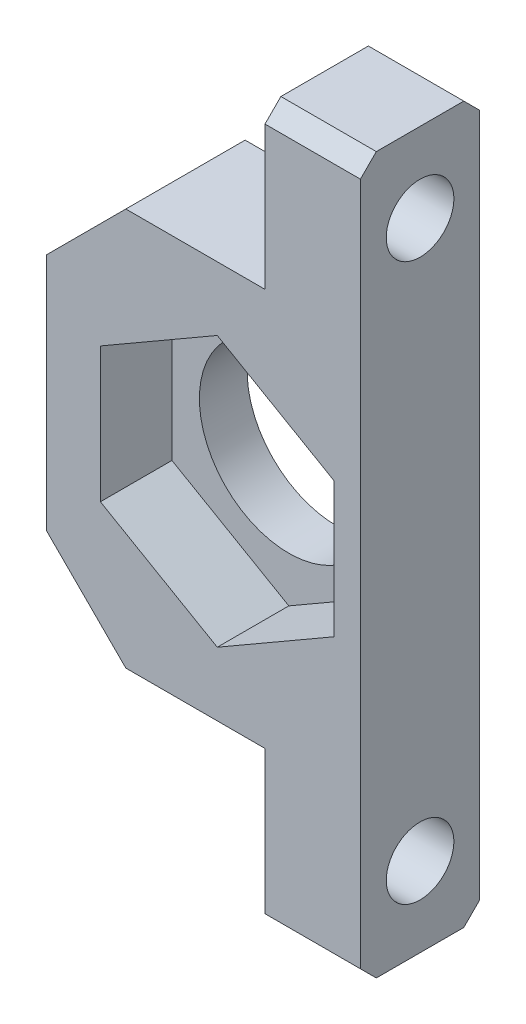
ISO-10303-21;
HEADER;
FILE_DESCRIPTION(('STEP AP214'),'2;1');
FILE_NAME('part.step','',(''),(''),'','','');
FILE_SCHEMA(('AUTOMOTIVE_DESIGN { 1 0 10303 214 1 1 1 1 }'));
ENDSEC;
DATA;
#1=APPLICATION_CONTEXT('core data for automotive mechanical design processes');
#2=APPLICATION_PROTOCOL_DEFINITION('international standard','automotive_design',2000,#1);
#3=PRODUCT_CONTEXT('',#1,'mechanical');
#4=PRODUCT('Part','Part','',(#3));
#5=PRODUCT_RELATED_PRODUCT_CATEGORY('part','',(#4));
#6=PRODUCT_DEFINITION_FORMATION('','',#4);
#7=PRODUCT_DEFINITION_CONTEXT('part definition',#1,'design');
#8=PRODUCT_DEFINITION('design','',#6,#7);
#9=PRODUCT_DEFINITION_SHAPE('','',#8);
#10=(LENGTH_UNIT() NAMED_UNIT(*) SI_UNIT(.MILLI.,.METRE.));
#11=(NAMED_UNIT(*) PLANE_ANGLE_UNIT() SI_UNIT($,.RADIAN.));
#12=(NAMED_UNIT(*) SI_UNIT($,.STERADIAN.) SOLID_ANGLE_UNIT());
#13=UNCERTAINTY_MEASURE_WITH_UNIT(LENGTH_MEASURE(1.E-05),#10,'distance_accuracy_value','');
#14=(GEOMETRIC_REPRESENTATION_CONTEXT(3) GLOBAL_UNCERTAINTY_ASSIGNED_CONTEXT((#13)) GLOBAL_UNIT_ASSIGNED_CONTEXT((#10,
#11,#12)) REPRESENTATION_CONTEXT('',''));
#15=CARTESIAN_POINT('',(0.,0.,0.));
#16=DIRECTION('',(0.,0.,1.));
#17=DIRECTION('',(1.,0.,0.));
#18=AXIS2_PLACEMENT_3D('',#15,#16,#17);
#19=CARTESIAN_POINT('',(-58.,350.506526421984,15.));
#20=DIRECTION('',(0.,0.,-1.));
#21=DIRECTION('',(-1.,0.,0.));
#22=AXIS2_PLACEMENT_3D('',#19,#20,#21);
#23=CYLINDRICAL_SURFACE('',#22,11.25);
#24=CARTESIAN_POINT('',(-58.,350.506526421984,0.));
#25=DIRECTION('',(0.,0.,1.));
#26=DIRECTION('',(1.,0.,0.));
#27=AXIS2_PLACEMENT_3D('',#24,#25,#26);
#28=CIRCLE('',#27,11.25);
#29=CARTESIAN_POINT('',(-46.75,350.506526421984,0.));
#30=VERTEX_POINT('',#29);
#31=EDGE_CURVE('E239',#30,#30,#28,.T.);
#32=ORIENTED_EDGE('',*,*,#31,.F.);
#33=EDGE_LOOP('',(#32));
#34=FACE_BOUND('',#33,.T.);
#35=CARTESIAN_POINT('',(-58.,350.506526421984,6.));
#36=DIRECTION('',(0.,0.,1.));
#37=DIRECTION('',(1.,0.,0.));
#38=AXIS2_PLACEMENT_3D('',#35,#36,#37);
#39=CIRCLE('',#38,11.25);
#40=CARTESIAN_POINT('',(-46.75,350.506526421984,6.));
#41=VERTEX_POINT('',#40);
#42=EDGE_CURVE('E221',#41,#41,#39,.T.);
#43=ORIENTED_EDGE('',*,*,#42,.T.);
#44=EDGE_LOOP('',(#43));
#45=FACE_BOUND('',#44,.T.);
#46=ADVANCED_FACE('F34',(#34,#45),#23,.F.);
#47=CARTESIAN_POINT('',(0.,0.,15.));
#48=DIRECTION('',(0.,0.,-1.));
#49=DIRECTION('',(-1.,0.,0.));
#50=AXIS2_PLACEMENT_3D('',#47,#48,#49);
#51=PLANE('',#50);
#52=DIRECTION('',(-0.866025403784437,-0.500000000000002,0.));
#53=VECTOR('',#52,1.);
#54=CARTESIAN_POINT('',(-58.,367.480624336159,15.));
#55=LINE('',#54,#53);
#56=CARTESIAN_POINT('',(-58.0000000000001,367.480624336159,15.));
#57=VERTEX_POINT('',#56);
#58=CARTESIAN_POINT('',(-72.7,358.993575379072,15.));
#59=VERTEX_POINT('',#58);
#60=EDGE_CURVE('E209',#57,#59,#55,.T.);
#61=ORIENTED_EDGE('',*,*,#60,.F.);
#62=DIRECTION('',(-0.866025403784437,0.500000000000003,0.));
#63=VECTOR('',#62,1.);
#64=CARTESIAN_POINT('',(-43.3,358.993575379072,15.));
#65=LINE('',#64,#63);
#66=CARTESIAN_POINT('',(-43.3,358.993575379072,15.));
#67=VERTEX_POINT('',#66);
#68=EDGE_CURVE('E177',#67,#57,#65,.T.);
#69=ORIENTED_EDGE('',*,*,#68,.F.);
#70=DIRECTION('',(0.,1.,0.));
#71=VECTOR('',#70,1.);
#72=CARTESIAN_POINT('',(-43.3,342.019477464897,15.));
#73=LINE('',#72,#71);
#74=CARTESIAN_POINT('',(-43.3,342.019477464897,15.));
#75=VERTEX_POINT('',#74);
#76=EDGE_CURVE('E195',#75,#67,#73,.T.);
#77=ORIENTED_EDGE('',*,*,#76,.F.);
#78=DIRECTION('',(0.866025403784438,0.500000000000001,0.));
#79=VECTOR('',#78,1.);
#80=CARTESIAN_POINT('',(-58.,333.532428507809,15.));
#81=LINE('',#80,#79);
#82=CARTESIAN_POINT('',(-58.,333.532428507809,15.));
#83=VERTEX_POINT('',#82);
#84=EDGE_CURVE('E198',#83,#75,#81,.T.);
#85=ORIENTED_EDGE('',*,*,#84,.F.);
#86=DIRECTION('',(0.866025403784438,-0.500000000000001,0.));
#87=VECTOR('',#86,1.);
#88=CARTESIAN_POINT('',(-72.7,342.019477464897,15.));
#89=LINE('',#88,#87);
#90=CARTESIAN_POINT('',(-72.7,342.019477464897,15.));
#91=VERTEX_POINT('',#90);
#92=EDGE_CURVE('E214',#91,#83,#89,.T.);
#93=ORIENTED_EDGE('',*,*,#92,.F.);
#94=DIRECTION('',(0.,-1.,0.));
#95=VECTOR('',#94,1.);
#96=CARTESIAN_POINT('',(-72.7,358.993575379072,15.));
#97=LINE('',#96,#95);
#98=EDGE_CURVE('E211',#59,#91,#97,.T.);
#99=ORIENTED_EDGE('',*,*,#98,.F.);
#100=EDGE_LOOP('',(#61,#69,#77,#85,#93,#99));
#101=FACE_BOUND('',#100,.T.);
#102=DIRECTION('',(0.,-1.,0.));
#103=VECTOR('',#102,1.);
#104=CARTESIAN_POINT('',(-52.,325.506526421984,15.));
#105=LINE('',#104,#103);
#106=CARTESIAN_POINT('',(-52.,325.506526421984,15.));
#107=VERTEX_POINT('',#106);
#108=CARTESIAN_POINT('',(-52.,307.506526421984,15.));
#109=VERTEX_POINT('',#108);
#110=EDGE_CURVE('E251',#107,#109,#105,.T.);
#111=ORIENTED_EDGE('',*,*,#110,.T.);
#112=DIRECTION('',(1.,0.,0.));
#113=VECTOR('',#112,1.);
#114=CARTESIAN_POINT('',(0.,307.506526421984,15.));
#115=LINE('',#114,#113);
#116=CARTESIAN_POINT('',(-40.,307.506526421984,15.));
#117=VERTEX_POINT('',#116);
#118=EDGE_CURVE('E316',#109,#117,#115,.T.);
#119=ORIENTED_EDGE('',*,*,#118,.T.);
#120=DIRECTION('',(0.,1.,0.));
#121=VECTOR('',#120,1.);
#122=CARTESIAN_POINT('',(-40.,395.506526421984,15.));
#123=LINE('',#122,#121);
#124=CARTESIAN_POINT('',(-40.,393.506526421984,15.));
#125=VERTEX_POINT('',#124);
#126=EDGE_CURVE('E254',#117,#125,#123,.T.);
#127=ORIENTED_EDGE('',*,*,#126,.T.);
#128=DIRECTION('',(-1.,0.,0.));
#129=VECTOR('',#128,1.);
#130=CARTESIAN_POINT('',(0.,393.506526421984,15.));
#131=LINE('',#130,#129);
#132=CARTESIAN_POINT('',(-52.,393.506526421984,15.));
#133=VERTEX_POINT('',#132);
#134=EDGE_CURVE('E311',#125,#133,#131,.T.);
#135=ORIENTED_EDGE('',*,*,#134,.T.);
#136=DIRECTION('',(0.,-1.,0.));
#137=VECTOR('',#136,1.);
#138=CARTESIAN_POINT('',(-52.,375.506526421984,15.));
#139=LINE('',#138,#137);
#140=CARTESIAN_POINT('',(-52.,375.506526421984,15.));
#141=VERTEX_POINT('',#140);
#142=EDGE_CURVE('E257',#133,#141,#139,.T.);
#143=ORIENTED_EDGE('',*,*,#142,.T.);
#144=DIRECTION('',(-1.,0.,0.));
#145=VECTOR('',#144,1.);
#146=CARTESIAN_POINT('',(-52.,375.506526421984,15.));
#147=LINE('',#146,#145);
#148=CARTESIAN_POINT('',(-69.4995217591309,375.506526421984,15.));
#149=VERTEX_POINT('',#148);
#150=EDGE_CURVE('E259',#141,#149,#147,.T.);
#151=ORIENTED_EDGE('',*,*,#150,.T.);
#152=DIRECTION('',(0.707106781186549,0.707106781186546,0.));
#153=VECTOR('',#152,1.);
#154=CARTESIAN_POINT('',(-79.4995217591309,365.506526421984,15.));
#155=LINE('',#154,#153);
#156=CARTESIAN_POINT('',(-79.4995217591309,365.506526421984,15.));
#157=VERTEX_POINT('',#156);
#158=EDGE_CURVE('E305',#149,#157,#155,.F.);
#159=ORIENTED_EDGE('',*,*,#158,.T.);
#160=DIRECTION('',(0.,-1.,0.));
#161=VECTOR('',#160,1.);
#162=CARTESIAN_POINT('',(-79.4995217591309,375.506526421984,15.));
#163=LINE('',#162,#161);
#164=CARTESIAN_POINT('',(-79.4995217591309,335.506526421984,15.));
#165=VERTEX_POINT('',#164);
#166=EDGE_CURVE('E245',#157,#165,#163,.T.);
#167=ORIENTED_EDGE('',*,*,#166,.T.);
#168=DIRECTION('',(-0.707106781186546,0.707106781186549,0.));
#169=VECTOR('',#168,1.);
#170=CARTESIAN_POINT('',(-69.4995217591309,325.506526421984,15.));
#171=LINE('',#170,#169);
#172=CARTESIAN_POINT('',(-69.4995217591309,325.506526421984,15.));
#173=VERTEX_POINT('',#172);
#174=EDGE_CURVE('E307',#165,#173,#171,.F.);
#175=ORIENTED_EDGE('',*,*,#174,.T.);
#176=DIRECTION('',(1.,0.,0.));
#177=VECTOR('',#176,1.);
#178=CARTESIAN_POINT('',(-52.,325.506526421984,15.));
#179=LINE('',#178,#177);
#180=EDGE_CURVE('E248',#173,#107,#179,.T.);
#181=ORIENTED_EDGE('',*,*,#180,.T.);
#182=EDGE_LOOP('',(#111,#119,#127,#135,#143,#151,#159,#167,#175,#181));
#183=FACE_BOUND('',#182,.T.);
#184=ADVANCED_FACE('F380',(#101,#183),#51,.F.);
#185=CARTESIAN_POINT('',(0.,0.,0.));
#186=DIRECTION('',(0.,0.,-1.));
#187=DIRECTION('',(-1.,0.,0.));
#188=AXIS2_PLACEMENT_3D('',#185,#186,#187);
#189=PLANE('',#188);
#190=DIRECTION('',(0.,1.,0.));
#191=VECTOR('',#190,1.);
#192=CARTESIAN_POINT('',(-40.,395.506526421984,0.));
#193=LINE('',#192,#191);
#194=CARTESIAN_POINT('',(-40.,307.506526421984,0.));
#195=VERTEX_POINT('',#194);
#196=CARTESIAN_POINT('',(-40.,393.506526421984,0.));
#197=VERTEX_POINT('',#196);
#198=EDGE_CURVE('E270',#195,#197,#193,.T.);
#199=ORIENTED_EDGE('',*,*,#198,.F.);
#200=DIRECTION('',(-1.,0.,0.));
#201=VECTOR('',#200,1.);
#202=CARTESIAN_POINT('',(-52.,307.506526421984,0.));
#203=LINE('',#202,#201);
#204=CARTESIAN_POINT('',(-52.,307.506526421984,0.));
#205=VERTEX_POINT('',#204);
#206=EDGE_CURVE('E338',#195,#205,#203,.T.);
#207=ORIENTED_EDGE('',*,*,#206,.T.);
#208=DIRECTION('',(0.,-1.,0.));
#209=VECTOR('',#208,1.);
#210=CARTESIAN_POINT('',(-52.,325.506526421984,0.));
#211=LINE('',#210,#209);
#212=CARTESIAN_POINT('',(-52.,325.506526421984,0.));
#213=VERTEX_POINT('',#212);
#214=EDGE_CURVE('E267',#213,#205,#211,.T.);
#215=ORIENTED_EDGE('',*,*,#214,.F.);
#216=DIRECTION('',(1.,0.,0.));
#217=VECTOR('',#216,1.);
#218=CARTESIAN_POINT('',(-52.,325.506526421984,0.));
#219=LINE('',#218,#217);
#220=CARTESIAN_POINT('',(-69.4995217591309,325.506526421984,0.));
#221=VERTEX_POINT('',#220);
#222=EDGE_CURVE('E265',#221,#213,#219,.T.);
#223=ORIENTED_EDGE('',*,*,#222,.F.);
#224=DIRECTION('',(0.707106781186546,-0.707106781186549,0.));
#225=VECTOR('',#224,1.);
#226=CARTESIAN_POINT('',(128.003502331427,128.003502331426,0.));
#227=LINE('',#226,#225);
#228=CARTESIAN_POINT('',(-79.4995217591309,335.506526421984,0.));
#229=VERTEX_POINT('',#228);
#230=EDGE_CURVE('E298',#221,#229,#227,.F.);
#231=ORIENTED_EDGE('',*,*,#230,.T.);
#232=DIRECTION('',(0.,-1.,0.));
#233=VECTOR('',#232,1.);
#234=CARTESIAN_POINT('',(-79.4995217591309,375.506526421984,0.));
#235=LINE('',#234,#233);
#236=CARTESIAN_POINT('',(-79.4995217591309,365.506526421984,0.));
#237=VERTEX_POINT('',#236);
#238=EDGE_CURVE('E244',#237,#229,#235,.T.);
#239=ORIENTED_EDGE('',*,*,#238,.F.);
#240=DIRECTION('',(-0.707106781186549,-0.707106781186546,0.));
#241=VECTOR('',#240,1.);
#242=CARTESIAN_POINT('',(-222.503024090557,222.503024090559,0.));
#243=LINE('',#242,#241);
#244=CARTESIAN_POINT('',(-69.4995217591308,375.506526421984,0.));
#245=VERTEX_POINT('',#244);
#246=EDGE_CURVE('E296',#237,#245,#243,.F.);
#247=ORIENTED_EDGE('',*,*,#246,.T.);
#248=DIRECTION('',(-1.,0.,0.));
#249=VECTOR('',#248,1.);
#250=CARTESIAN_POINT('',(-52.,375.506526421984,0.));
#251=LINE('',#250,#249);
#252=CARTESIAN_POINT('',(-52.,375.506526421984,0.));
#253=VERTEX_POINT('',#252);
#254=EDGE_CURVE('E249',#253,#245,#251,.T.);
#255=ORIENTED_EDGE('',*,*,#254,.F.);
#256=DIRECTION('',(0.,-1.,0.));
#257=VECTOR('',#256,1.);
#258=CARTESIAN_POINT('',(-52.,375.506526421984,0.));
#259=LINE('',#258,#257);
#260=CARTESIAN_POINT('',(-52.,393.506526421984,0.));
#261=VERTEX_POINT('',#260);
#262=EDGE_CURVE('E273',#261,#253,#259,.T.);
#263=ORIENTED_EDGE('',*,*,#262,.F.);
#264=DIRECTION('',(1.,0.,0.));
#265=VECTOR('',#264,1.);
#266=CARTESIAN_POINT('',(-40.,393.506526421984,0.));
#267=LINE('',#266,#265);
#268=EDGE_CURVE('E336',#261,#197,#267,.T.);
#269=ORIENTED_EDGE('',*,*,#268,.T.);
#270=EDGE_LOOP('',(#199,#207,#215,#223,#231,#239,#247,#255,#263,#269));
#271=FACE_BOUND('',#270,.T.);
#272=ORIENTED_EDGE('',*,*,#31,.T.);
#273=EDGE_LOOP('',(#272));
#274=FACE_BOUND('',#273,.T.);
#275=ADVANCED_FACE('F354',(#271,#274),#189,.T.);
#276=CARTESIAN_POINT('',(-79.4995217591309,375.506526421984,15.));
#277=DIRECTION('',(1.,0.,0.));
#278=DIRECTION('',(0.,1.,0.));
#279=AXIS2_PLACEMENT_3D('',#276,#277,#278);
#280=PLANE('',#279);
#281=ORIENTED_EDGE('',*,*,#238,.T.);
#282=DIRECTION('',(0.,0.,1.));
#283=VECTOR('',#282,1.);
#284=CARTESIAN_POINT('',(-79.4995217591309,335.506526421984,15.));
#285=LINE('',#284,#283);
#286=EDGE_CURVE('E303',#229,#165,#285,.T.);
#287=ORIENTED_EDGE('',*,*,#286,.T.);
#288=ORIENTED_EDGE('',*,*,#166,.F.);
#289=DIRECTION('',(0.,0.,-1.));
#290=VECTOR('',#289,1.);
#291=CARTESIAN_POINT('',(-79.4995217591309,365.506526421984,15.));
#292=LINE('',#291,#290);
#293=EDGE_CURVE('E300',#157,#237,#292,.T.);
#294=ORIENTED_EDGE('',*,*,#293,.T.);
#295=EDGE_LOOP('',(#281,#287,#288,#294));
#296=FACE_BOUND('',#295,.T.);
#297=ADVANCED_FACE('F392',(#296),#280,.F.);
#298=CARTESIAN_POINT('',(-52.,325.506526421984,15.));
#299=DIRECTION('',(0.,1.,0.));
#300=DIRECTION('',(0.,0.,1.));
#301=AXIS2_PLACEMENT_3D('',#298,#299,#300);
#302=PLANE('',#301);
#303=ORIENTED_EDGE('',*,*,#180,.F.);
#304=DIRECTION('',(0.,0.,-1.));
#305=VECTOR('',#304,1.);
#306=CARTESIAN_POINT('',(-69.4995217591309,325.506526421984,15.));
#307=LINE('',#306,#305);
#308=EDGE_CURVE('E293',#173,#221,#307,.T.);
#309=ORIENTED_EDGE('',*,*,#308,.T.);
#310=ORIENTED_EDGE('',*,*,#222,.T.);
#311=DIRECTION('',(0.,0.,-1.));
#312=VECTOR('',#311,1.);
#313=CARTESIAN_POINT('',(-52.,325.506526421984,15.));
#314=LINE('',#313,#312);
#315=EDGE_CURVE('E290',#107,#213,#314,.T.);
#316=ORIENTED_EDGE('',*,*,#315,.F.);
#317=EDGE_LOOP('',(#303,#309,#310,#316));
#318=FACE_BOUND('',#317,.T.);
#319=ADVANCED_FACE('F386',(#318),#302,.F.);
#320=CARTESIAN_POINT('',(-52.,325.506526421984,15.));
#321=DIRECTION('',(1.,0.,0.));
#322=DIRECTION('',(0.,0.,-1.));
#323=AXIS2_PLACEMENT_3D('',#320,#321,#322);
#324=PLANE('',#323);
#325=CARTESIAN_POINT('',(-52.,315.506526421984,7.5));
#326=DIRECTION('',(-1.,0.,0.));
#327=DIRECTION('',(0.,0.,1.));
#328=AXIS2_PLACEMENT_3D('',#325,#326,#327);
#329=CIRCLE('',#328,4.25);
#330=CARTESIAN_POINT('',(-52.,315.506526421984,11.75));
#331=VERTEX_POINT('',#330);
#332=EDGE_CURVE('E233',#331,#331,#329,.T.);
#333=ORIENTED_EDGE('',*,*,#332,.F.);
#334=EDGE_LOOP('',(#333));
#335=FACE_BOUND('',#334,.T.);
#336=DIRECTION('',(0.,0.,-1.));
#337=VECTOR('',#336,1.);
#338=CARTESIAN_POINT('',(-52.,305.506526421984,15.));
#339=LINE('',#338,#337);
#340=CARTESIAN_POINT('',(-52.,305.506526421984,13.));
#341=VERTEX_POINT('',#340);
#342=CARTESIAN_POINT('',(-52.,305.506526421984,2.00000000000003));
#343=VERTEX_POINT('',#342);
#344=EDGE_CURVE('E287',#341,#343,#339,.T.);
#345=ORIENTED_EDGE('',*,*,#344,.F.);
#346=DIRECTION('',(0.,-0.707106781186548,-0.707106781186548));
#347=VECTOR('',#346,1.);
#348=CARTESIAN_POINT('',(-52.,307.506526421984,15.));
#349=LINE('',#348,#347);
#350=EDGE_CURVE('E334',#341,#109,#349,.F.);
#351=ORIENTED_EDGE('',*,*,#350,.T.);
#352=ORIENTED_EDGE('',*,*,#110,.F.);
#353=ORIENTED_EDGE('',*,*,#315,.T.);
#354=ORIENTED_EDGE('',*,*,#214,.T.);
#355=DIRECTION('',(0.,-0.707106781186552,0.707106781186543));
#356=VECTOR('',#355,1.);
#357=CARTESIAN_POINT('',(-52.,305.506526421984,2.00000000000003));
#358=LINE('',#357,#356);
#359=EDGE_CURVE('E332',#205,#343,#358,.T.);
#360=ORIENTED_EDGE('',*,*,#359,.T.);
#361=EDGE_LOOP('',(#345,#351,#352,#353,#354,#360));
#362=FACE_BOUND('',#361,.T.);
#363=ADVANCED_FACE('F369',(#335,#362),#324,.F.);
#364=CARTESIAN_POINT('',(-40.,305.506526421984,15.));
#365=DIRECTION('',(0.,1.,0.));
#366=DIRECTION('',(0.,0.,1.));
#367=AXIS2_PLACEMENT_3D('',#364,#365,#366);
#368=PLANE('',#367);
#369=DIRECTION('',(0.,0.,-1.));
#370=VECTOR('',#369,1.);
#371=CARTESIAN_POINT('',(-40.,305.506526421984,15.));
#372=LINE('',#371,#370);
#373=CARTESIAN_POINT('',(-40.,305.506526421984,13.));
#374=VERTEX_POINT('',#373);
#375=CARTESIAN_POINT('',(-40.,305.506526421984,2.00000000000003));
#376=VERTEX_POINT('',#375);
#377=EDGE_CURVE('E284',#374,#376,#372,.T.);
#378=ORIENTED_EDGE('',*,*,#377,.F.);
#379=DIRECTION('',(-1.,0.,0.));
#380=VECTOR('',#379,1.);
#381=CARTESIAN_POINT('',(-40.,305.506526421984,13.));
#382=LINE('',#381,#380);
#383=EDGE_CURVE('E330',#374,#341,#382,.T.);
#384=ORIENTED_EDGE('',*,*,#383,.T.);
#385=ORIENTED_EDGE('',*,*,#344,.T.);
#386=DIRECTION('',(1.,0.,0.));
#387=VECTOR('',#386,1.);
#388=CARTESIAN_POINT('',(-40.,305.506526421984,2.00000000000003));
#389=LINE('',#388,#387);
#390=EDGE_CURVE('E327',#343,#376,#389,.T.);
#391=ORIENTED_EDGE('',*,*,#390,.T.);
#392=EDGE_LOOP('',(#378,#384,#385,#391));
#393=FACE_BOUND('',#392,.T.);
#394=ADVANCED_FACE('F373',(#393),#368,.F.);
#395=CARTESIAN_POINT('',(-40.,395.506526421984,15.));
#396=DIRECTION('',(-1.,0.,0.));
#397=DIRECTION('',(0.,-1.,0.));
#398=AXIS2_PLACEMENT_3D('',#395,#396,#397);
#399=PLANE('',#398);
#400=CARTESIAN_POINT('',(-40.,315.506526421984,7.5));
#401=DIRECTION('',(-1.,0.,0.));
#402=DIRECTION('',(0.,0.,1.));
#403=AXIS2_PLACEMENT_3D('',#400,#401,#402);
#404=CIRCLE('',#403,4.25);
#405=CARTESIAN_POINT('',(-40.,315.506526421984,11.75));
#406=VERTEX_POINT('',#405);
#407=EDGE_CURVE('E229',#406,#406,#404,.T.);
#408=ORIENTED_EDGE('',*,*,#407,.T.);
#409=EDGE_LOOP('',(#408));
#410=FACE_BOUND('',#409,.T.);
#411=CARTESIAN_POINT('',(-40.,385.506526421984,7.5));
#412=DIRECTION('',(-1.,0.,0.));
#413=DIRECTION('',(0.,0.,1.));
#414=AXIS2_PLACEMENT_3D('',#411,#412,#413);
#415=CIRCLE('',#414,4.25);
#416=CARTESIAN_POINT('',(-40.,385.506526421984,11.75));
#417=VERTEX_POINT('',#416);
#418=EDGE_CURVE('E236',#417,#417,#415,.T.);
#419=ORIENTED_EDGE('',*,*,#418,.T.);
#420=EDGE_LOOP('',(#419));
#421=FACE_BOUND('',#420,.T.);
#422=ORIENTED_EDGE('',*,*,#126,.F.);
#423=DIRECTION('',(0.,0.707106781186548,0.707106781186548));
#424=VECTOR('',#423,1.);
#425=CARTESIAN_POINT('',(-40.,307.506526421984,15.));
#426=LINE('',#425,#424);
#427=EDGE_CURVE('E325',#117,#374,#426,.F.);
#428=ORIENTED_EDGE('',*,*,#427,.T.);
#429=ORIENTED_EDGE('',*,*,#377,.T.);
#430=DIRECTION('',(0.,0.707106781186552,-0.707106781186543));
#431=VECTOR('',#430,1.);
#432=CARTESIAN_POINT('',(-40.,305.506526421984,2.00000000000003));
#433=LINE('',#432,#431);
#434=EDGE_CURVE('E323',#376,#195,#433,.T.);
#435=ORIENTED_EDGE('',*,*,#434,.T.);
#436=ORIENTED_EDGE('',*,*,#198,.T.);
#437=DIRECTION('',(0.,0.707106781186543,0.707106781186552));
#438=VECTOR('',#437,1.);
#439=CARTESIAN_POINT('',(-40.,395.506526421984,2.00000000000003));
#440=LINE('',#439,#438);
#441=CARTESIAN_POINT('',(-40.,395.506526421984,2.00000000000003));
#442=VERTEX_POINT('',#441);
#443=EDGE_CURVE('E321',#197,#442,#440,.T.);
#444=ORIENTED_EDGE('',*,*,#443,.T.);
#445=DIRECTION('',(0.,0.,-1.));
#446=VECTOR('',#445,1.);
#447=CARTESIAN_POINT('',(-40.,395.506526421984,15.));
#448=LINE('',#447,#446);
#449=CARTESIAN_POINT('',(-40.,395.506526421984,13.));
#450=VERTEX_POINT('',#449);
#451=EDGE_CURVE('E281',#450,#442,#448,.T.);
#452=ORIENTED_EDGE('',*,*,#451,.F.);
#453=DIRECTION('',(0.,0.707106781186548,-0.707106781186548));
#454=VECTOR('',#453,1.);
#455=CARTESIAN_POINT('',(-40.,393.506526421984,15.));
#456=LINE('',#455,#454);
#457=EDGE_CURVE('E319',#450,#125,#456,.F.);
#458=ORIENTED_EDGE('',*,*,#457,.T.);
#459=EDGE_LOOP('',(#422,#428,#429,#435,#436,#444,#452,#458));
#460=FACE_BOUND('',#459,.T.);
#461=ADVANCED_FACE('F359',(#410,#421,#460),#399,.F.);
#462=CARTESIAN_POINT('',(-40.,395.506526421984,15.));
#463=DIRECTION('',(0.,-1.,0.));
#464=DIRECTION('',(0.,0.,-1.));
#465=AXIS2_PLACEMENT_3D('',#462,#463,#464);
#466=PLANE('',#465);
#467=ORIENTED_EDGE('',*,*,#451,.T.);
#468=DIRECTION('',(-1.,0.,0.));
#469=VECTOR('',#468,1.);
#470=CARTESIAN_POINT('',(-52.,395.506526421984,2.00000000000003));
#471=LINE('',#470,#469);
#472=CARTESIAN_POINT('',(-52.,395.506526421984,2.00000000000003));
#473=VERTEX_POINT('',#472);
#474=EDGE_CURVE('E342',#442,#473,#471,.T.);
#475=ORIENTED_EDGE('',*,*,#474,.T.);
#476=DIRECTION('',(0.,0.,-1.));
#477=VECTOR('',#476,1.);
#478=CARTESIAN_POINT('',(-52.,395.506526421984,15.));
#479=LINE('',#478,#477);
#480=CARTESIAN_POINT('',(-52.,395.506526421984,13.));
#481=VERTEX_POINT('',#480);
#482=EDGE_CURVE('E279',#481,#473,#479,.T.);
#483=ORIENTED_EDGE('',*,*,#482,.F.);
#484=DIRECTION('',(1.,0.,0.));
#485=VECTOR('',#484,1.);
#486=CARTESIAN_POINT('',(-40.,395.506526421984,13.));
#487=LINE('',#486,#485);
#488=EDGE_CURVE('E340',#481,#450,#487,.T.);
#489=ORIENTED_EDGE('',*,*,#488,.T.);
#490=EDGE_LOOP('',(#467,#475,#483,#489));
#491=FACE_BOUND('',#490,.T.);
#492=ADVANCED_FACE('F344',(#491),#466,.F.);
#493=CARTESIAN_POINT('',(-52.,375.506526421984,15.));
#494=DIRECTION('',(1.,0.,0.));
#495=DIRECTION('',(0.,0.,-1.));
#496=AXIS2_PLACEMENT_3D('',#493,#494,#495);
#497=PLANE('',#496);
#498=CARTESIAN_POINT('',(-52.,385.506526421984,7.5));
#499=DIRECTION('',(-1.,0.,0.));
#500=DIRECTION('',(0.,0.,1.));
#501=AXIS2_PLACEMENT_3D('',#498,#499,#500);
#502=CIRCLE('',#501,4.25);
#503=CARTESIAN_POINT('',(-52.,385.506526421984,11.75));
#504=VERTEX_POINT('',#503);
#505=EDGE_CURVE('E232',#504,#504,#502,.T.);
#506=ORIENTED_EDGE('',*,*,#505,.F.);
#507=EDGE_LOOP('',(#506));
#508=FACE_BOUND('',#507,.T.);
#509=ORIENTED_EDGE('',*,*,#482,.T.);
#510=DIRECTION('',(0.,-0.707106781186543,-0.707106781186552));
#511=VECTOR('',#510,1.);
#512=CARTESIAN_POINT('',(-52.,395.506526421984,2.00000000000003));
#513=LINE('',#512,#511);
#514=EDGE_CURVE('E11',#473,#261,#513,.T.);
#515=ORIENTED_EDGE('',*,*,#514,.T.);
#516=ORIENTED_EDGE('',*,*,#262,.T.);
#517=DIRECTION('',(0.,0.,-1.));
#518=VECTOR('',#517,1.);
#519=CARTESIAN_POINT('',(-52.,375.506526421984,15.));
#520=LINE('',#519,#518);
#521=EDGE_CURVE('E262',#141,#253,#520,.T.);
#522=ORIENTED_EDGE('',*,*,#521,.F.);
#523=ORIENTED_EDGE('',*,*,#142,.F.);
#524=DIRECTION('',(0.,-0.707106781186548,0.707106781186548));
#525=VECTOR('',#524,1.);
#526=CARTESIAN_POINT('',(-52.,393.506526421984,15.));
#527=LINE('',#526,#525);
#528=EDGE_CURVE('E42',#133,#481,#527,.F.);
#529=ORIENTED_EDGE('',*,*,#528,.T.);
#530=EDGE_LOOP('',(#509,#515,#516,#522,#523,#529));
#531=FACE_BOUND('',#530,.T.);
#532=ADVANCED_FACE('F348',(#508,#531),#497,.F.);
#533=CARTESIAN_POINT('',(-52.,375.506526421984,15.));
#534=DIRECTION('',(0.,-1.,0.));
#535=DIRECTION('',(0.,0.,-1.));
#536=AXIS2_PLACEMENT_3D('',#533,#534,#535);
#537=PLANE('',#536);
#538=ORIENTED_EDGE('',*,*,#254,.T.);
#539=DIRECTION('',(0.,0.,1.));
#540=VECTOR('',#539,1.);
#541=CARTESIAN_POINT('',(-69.4995217591309,375.506526421984,15.));
#542=LINE('',#541,#540);
#543=EDGE_CURVE('E309',#245,#149,#542,.T.);
#544=ORIENTED_EDGE('',*,*,#543,.T.);
#545=ORIENTED_EDGE('',*,*,#150,.F.);
#546=ORIENTED_EDGE('',*,*,#521,.T.);
#547=EDGE_LOOP('',(#538,#544,#545,#546));
#548=FACE_BOUND('',#547,.T.);
#549=ADVANCED_FACE('F398',(#548),#537,.F.);
#550=CARTESIAN_POINT('',(-69.4995217591309,325.506526421984,15.));
#551=DIRECTION('',(0.707106781186549,0.707106781186545,0.));
#552=DIRECTION('',(0.,0.,-1.));
#553=AXIS2_PLACEMENT_3D('',#550,#551,#552);
#554=PLANE('',#553);
#555=ORIENTED_EDGE('',*,*,#174,.F.);
#556=ORIENTED_EDGE('',*,*,#286,.F.);
#557=ORIENTED_EDGE('',*,*,#230,.F.);
#558=ORIENTED_EDGE('',*,*,#308,.F.);
#559=EDGE_LOOP('',(#555,#556,#557,#558));
#560=FACE_BOUND('',#559,.T.);
#561=ADVANCED_FACE('F395',(#560),#554,.F.);
#562=CARTESIAN_POINT('',(-79.4995217591309,365.506526421984,15.));
#563=DIRECTION('',(0.707106781186545,-0.707106781186549,0.));
#564=DIRECTION('',(0.,0.,-1.));
#565=AXIS2_PLACEMENT_3D('',#562,#563,#564);
#566=PLANE('',#565);
#567=ORIENTED_EDGE('',*,*,#158,.F.);
#568=ORIENTED_EDGE('',*,*,#543,.F.);
#569=ORIENTED_EDGE('',*,*,#246,.F.);
#570=ORIENTED_EDGE('',*,*,#293,.F.);
#571=EDGE_LOOP('',(#567,#568,#569,#570));
#572=FACE_BOUND('',#571,.T.);
#573=ADVANCED_FACE('F397',(#572),#566,.F.);
#574=CARTESIAN_POINT('',(-40.,385.506526421984,7.5));
#575=DIRECTION('',(-1.,0.,0.));
#576=DIRECTION('',(0.,0.,1.));
#577=AXIS2_PLACEMENT_3D('',#574,#575,#576);
#578=CYLINDRICAL_SURFACE('',#577,4.25);
#579=ORIENTED_EDGE('',*,*,#418,.F.);
#580=EDGE_LOOP('',(#579));
#581=FACE_BOUND('',#580,.T.);
#582=ORIENTED_EDGE('',*,*,#505,.T.);
#583=EDGE_LOOP('',(#582));
#584=FACE_BOUND('',#583,.T.);
#585=ADVANCED_FACE('F404',(#581,#584),#578,.F.);
#586=CARTESIAN_POINT('',(-40.,315.506526421984,7.5));
#587=DIRECTION('',(-1.,0.,0.));
#588=DIRECTION('',(0.,0.,1.));
#589=AXIS2_PLACEMENT_3D('',#586,#587,#588);
#590=CYLINDRICAL_SURFACE('',#589,4.25);
#591=ORIENTED_EDGE('',*,*,#407,.F.);
#592=EDGE_LOOP('',(#591));
#593=FACE_BOUND('',#592,.T.);
#594=ORIENTED_EDGE('',*,*,#332,.T.);
#595=EDGE_LOOP('',(#594));
#596=FACE_BOUND('',#595,.T.);
#597=ADVANCED_FACE('F496',(#593,#596),#590,.F.);
#598=CARTESIAN_POINT('',(-43.3,358.993575379072,6.));
#599=DIRECTION('',(0.500000000000003,0.866025403784437,0.));
#600=DIRECTION('',(-0.866025403784437,0.500000000000003,0.));
#601=AXIS2_PLACEMENT_3D('',#598,#599,#600);
#602=PLANE('',#601);
#603=ORIENTED_EDGE('',*,*,#68,.T.);
#604=DIRECTION('',(0.,0.,1.));
#605=VECTOR('',#604,1.);
#606=CARTESIAN_POINT('',(-58.,367.480624336159,6.));
#607=LINE('',#606,#605);
#608=CARTESIAN_POINT('',(-58.,367.480624336159,6.));
#609=VERTEX_POINT('',#608);
#610=EDGE_CURVE('E170',#609,#57,#607,.T.);
#611=ORIENTED_EDGE('',*,*,#610,.F.);
#612=DIRECTION('',(-0.866025403784437,0.500000000000003,0.));
#613=VECTOR('',#612,1.);
#614=CARTESIAN_POINT('',(-43.3,358.993575379072,6.));
#615=LINE('',#614,#613);
#616=CARTESIAN_POINT('',(-43.3,358.993575379072,6.));
#617=VERTEX_POINT('',#616);
#618=EDGE_CURVE('E174',#617,#609,#615,.T.);
#619=ORIENTED_EDGE('',*,*,#618,.F.);
#620=DIRECTION('',(0.,0.,1.));
#621=VECTOR('',#620,1.);
#622=CARTESIAN_POINT('',(-43.3,358.993575379072,6.));
#623=LINE('',#622,#621);
#624=EDGE_CURVE('E219',#617,#67,#623,.T.);
#625=ORIENTED_EDGE('',*,*,#624,.T.);
#626=EDGE_LOOP('',(#603,#611,#619,#625));
#627=FACE_BOUND('',#626,.T.);
#628=ADVANCED_FACE('F172',(#627),#602,.F.);
#629=CARTESIAN_POINT('',(-43.3,342.019477464897,6.));
#630=DIRECTION('',(1.,0.,0.));
#631=DIRECTION('',(0.,0.,-1.));
#632=AXIS2_PLACEMENT_3D('',#629,#630,#631);
#633=PLANE('',#632);
#634=ORIENTED_EDGE('',*,*,#76,.T.);
#635=ORIENTED_EDGE('',*,*,#624,.F.);
#636=DIRECTION('',(0.,1.,0.));
#637=VECTOR('',#636,1.);
#638=CARTESIAN_POINT('',(-43.3,342.019477464897,6.));
#639=LINE('',#638,#637);
#640=CARTESIAN_POINT('',(-43.3,342.019477464897,6.));
#641=VERTEX_POINT('',#640);
#642=EDGE_CURVE('E182',#641,#617,#639,.T.);
#643=ORIENTED_EDGE('',*,*,#642,.F.);
#644=DIRECTION('',(0.,0.,1.));
#645=VECTOR('',#644,1.);
#646=CARTESIAN_POINT('',(-43.3,342.019477464897,6.));
#647=LINE('',#646,#645);
#648=EDGE_CURVE('E222',#641,#75,#647,.T.);
#649=ORIENTED_EDGE('',*,*,#648,.T.);
#650=EDGE_LOOP('',(#634,#635,#643,#649));
#651=FACE_BOUND('',#650,.T.);
#652=ADVANCED_FACE('F522',(#651),#633,.F.);
#653=CARTESIAN_POINT('',(-58.,333.532428507809,6.));
#654=DIRECTION('',(0.500000000000001,-0.866025403784438,0.));
#655=DIRECTION('',(0.866025403784438,0.500000000000002,0.));
#656=AXIS2_PLACEMENT_3D('',#653,#654,#655);
#657=PLANE('',#656);
#658=ORIENTED_EDGE('',*,*,#84,.T.);
#659=ORIENTED_EDGE('',*,*,#648,.F.);
#660=DIRECTION('',(0.866025403784438,0.500000000000001,0.));
#661=VECTOR('',#660,1.);
#662=CARTESIAN_POINT('',(-58.,333.532428507809,6.));
#663=LINE('',#662,#661);
#664=CARTESIAN_POINT('',(-58.,333.532428507809,6.));
#665=VERTEX_POINT('',#664);
#666=EDGE_CURVE('E205',#665,#641,#663,.T.);
#667=ORIENTED_EDGE('',*,*,#666,.F.);
#668=DIRECTION('',(0.,0.,1.));
#669=VECTOR('',#668,1.);
#670=CARTESIAN_POINT('',(-58.,333.532428507809,6.));
#671=LINE('',#670,#669);
#672=EDGE_CURVE('E224',#665,#83,#671,.T.);
#673=ORIENTED_EDGE('',*,*,#672,.T.);
#674=EDGE_LOOP('',(#658,#659,#667,#673));
#675=FACE_BOUND('',#674,.T.);
#676=ADVANCED_FACE('F532',(#675),#657,.F.);
#677=CARTESIAN_POINT('',(-72.7,342.019477464897,6.));
#678=DIRECTION('',(-0.500000000000001,-0.866025403784438,0.));
#679=DIRECTION('',(0.866025403784438,-0.500000000000002,0.));
#680=AXIS2_PLACEMENT_3D('',#677,#678,#679);
#681=PLANE('',#680);
#682=ORIENTED_EDGE('',*,*,#92,.T.);
#683=ORIENTED_EDGE('',*,*,#672,.F.);
#684=DIRECTION('',(0.866025403784438,-0.500000000000001,0.));
#685=VECTOR('',#684,1.);
#686=CARTESIAN_POINT('',(-72.7,342.019477464897,6.));
#687=LINE('',#686,#685);
#688=CARTESIAN_POINT('',(-72.7,342.019477464897,6.));
#689=VERTEX_POINT('',#688);
#690=EDGE_CURVE('E202',#689,#665,#687,.T.);
#691=ORIENTED_EDGE('',*,*,#690,.F.);
#692=DIRECTION('',(0.,0.,1.));
#693=VECTOR('',#692,1.);
#694=CARTESIAN_POINT('',(-72.7,342.019477464897,6.));
#695=LINE('',#694,#693);
#696=EDGE_CURVE('E226',#689,#91,#695,.T.);
#697=ORIENTED_EDGE('',*,*,#696,.T.);
#698=EDGE_LOOP('',(#682,#683,#691,#697));
#699=FACE_BOUND('',#698,.T.);
#700=ADVANCED_FACE('F543',(#699),#681,.F.);
#701=CARTESIAN_POINT('',(-72.7,358.993575379072,6.));
#702=DIRECTION('',(-1.,0.,0.));
#703=DIRECTION('',(0.,0.,1.));
#704=AXIS2_PLACEMENT_3D('',#701,#702,#703);
#705=PLANE('',#704);
#706=ORIENTED_EDGE('',*,*,#98,.T.);
#707=ORIENTED_EDGE('',*,*,#696,.F.);
#708=DIRECTION('',(0.,-1.,0.));
#709=VECTOR('',#708,1.);
#710=CARTESIAN_POINT('',(-72.7,358.993575379072,6.));
#711=LINE('',#710,#709);
#712=CARTESIAN_POINT('',(-72.7,358.993575379072,6.));
#713=VERTEX_POINT('',#712);
#714=EDGE_CURVE('E190',#713,#689,#711,.T.);
#715=ORIENTED_EDGE('',*,*,#714,.F.);
#716=DIRECTION('',(0.,0.,1.));
#717=VECTOR('',#716,1.);
#718=CARTESIAN_POINT('',(-72.7,358.993575379072,6.));
#719=LINE('',#718,#717);
#720=EDGE_CURVE('E181',#713,#59,#719,.T.);
#721=ORIENTED_EDGE('',*,*,#720,.T.);
#722=EDGE_LOOP('',(#706,#707,#715,#721));
#723=FACE_BOUND('',#722,.T.);
#724=ADVANCED_FACE('F554',(#723),#705,.F.);
#725=CARTESIAN_POINT('',(-58.,367.480624336159,6.));
#726=DIRECTION('',(-0.500000000000002,0.866025403784437,0.));
#727=DIRECTION('',(-0.866025403784437,-0.500000000000002,0.));
#728=AXIS2_PLACEMENT_3D('',#725,#726,#727);
#729=PLANE('',#728);
#730=ORIENTED_EDGE('',*,*,#60,.T.);
#731=ORIENTED_EDGE('',*,*,#720,.F.);
#732=DIRECTION('',(-0.866025403784437,-0.500000000000002,0.));
#733=VECTOR('',#732,1.);
#734=CARTESIAN_POINT('',(-58.,367.480624336159,6.));
#735=LINE('',#734,#733);
#736=EDGE_CURVE('E185',#609,#713,#735,.T.);
#737=ORIENTED_EDGE('',*,*,#736,.F.);
#738=ORIENTED_EDGE('',*,*,#610,.T.);
#739=EDGE_LOOP('',(#730,#731,#737,#738));
#740=FACE_BOUND('',#739,.T.);
#741=ADVANCED_FACE('F186',(#740),#729,.F.);
#742=CARTESIAN_POINT('',(0.,0.,6.));
#743=DIRECTION('',(0.,0.,1.));
#744=DIRECTION('',(1.,0.,0.));
#745=AXIS2_PLACEMENT_3D('',#742,#743,#744);
#746=PLANE('',#745);
#747=ORIENTED_EDGE('',*,*,#42,.F.);
#748=EDGE_LOOP('',(#747));
#749=FACE_BOUND('',#748,.T.);
#750=ORIENTED_EDGE('',*,*,#618,.T.);
#751=ORIENTED_EDGE('',*,*,#736,.T.);
#752=ORIENTED_EDGE('',*,*,#714,.T.);
#753=ORIENTED_EDGE('',*,*,#690,.T.);
#754=ORIENTED_EDGE('',*,*,#666,.T.);
#755=ORIENTED_EDGE('',*,*,#642,.T.);
#756=EDGE_LOOP('',(#750,#751,#752,#753,#754,#755));
#757=FACE_BOUND('',#756,.T.);
#758=ADVANCED_FACE('F192',(#749,#757),#746,.T.);
#759=CARTESIAN_POINT('',(0.,307.506526421984,15.));
#760=DIRECTION('',(0.,0.707106781186547,-0.707106781186547));
#761=DIRECTION('',(1.,0.,0.));
#762=AXIS2_PLACEMENT_3D('',#759,#760,#761);
#763=PLANE('',#762);
#764=ORIENTED_EDGE('',*,*,#350,.F.);
#765=ORIENTED_EDGE('',*,*,#383,.F.);
#766=ORIENTED_EDGE('',*,*,#427,.F.);
#767=ORIENTED_EDGE('',*,*,#118,.F.);
#768=EDGE_LOOP('',(#764,#765,#766,#767));
#769=FACE_BOUND('',#768,.T.);
#770=ADVANCED_FACE('F376',(#769),#763,.F.);
#771=CARTESIAN_POINT('',(-40.,305.506526421984,2.00000000000003));
#772=DIRECTION('',(0.,-0.707106781186543,-0.707106781186552));
#773=DIRECTION('',(-1.,0.,0.));
#774=AXIS2_PLACEMENT_3D('',#771,#772,#773);
#775=PLANE('',#774);
#776=ORIENTED_EDGE('',*,*,#359,.F.);
#777=ORIENTED_EDGE('',*,*,#206,.F.);
#778=ORIENTED_EDGE('',*,*,#434,.F.);
#779=ORIENTED_EDGE('',*,*,#390,.F.);
#780=EDGE_LOOP('',(#776,#777,#778,#779));
#781=FACE_BOUND('',#780,.T.);
#782=ADVANCED_FACE('F365',(#781),#775,.T.);
#783=CARTESIAN_POINT('',(-40.,395.506526421984,2.00000000000003));
#784=DIRECTION('',(0.,0.707106781186552,-0.707106781186542));
#785=DIRECTION('',(1.,0.,0.));
#786=AXIS2_PLACEMENT_3D('',#783,#784,#785);
#787=PLANE('',#786);
#788=ORIENTED_EDGE('',*,*,#443,.F.);
#789=ORIENTED_EDGE('',*,*,#268,.F.);
#790=ORIENTED_EDGE('',*,*,#514,.F.);
#791=ORIENTED_EDGE('',*,*,#474,.F.);
#792=EDGE_LOOP('',(#788,#789,#790,#791));
#793=FACE_BOUND('',#792,.T.);
#794=ADVANCED_FACE('F356',(#793),#787,.T.);
#795=CARTESIAN_POINT('',(0.,393.506526421984,15.));
#796=DIRECTION('',(0.,-0.707106781186547,-0.707106781186547));
#797=DIRECTION('',(-1.,0.,0.));
#798=AXIS2_PLACEMENT_3D('',#795,#796,#797);
#799=PLANE('',#798);
#800=ORIENTED_EDGE('',*,*,#457,.F.);
#801=ORIENTED_EDGE('',*,*,#488,.F.);
#802=ORIENTED_EDGE('',*,*,#528,.F.);
#803=ORIENTED_EDGE('',*,*,#134,.F.);
#804=EDGE_LOOP('',(#800,#801,#802,#803));
#805=FACE_BOUND('',#804,.T.);
#806=ADVANCED_FACE('F36',(#805),#799,.F.);
#807=CLOSED_SHELL('',(#46,#184,#275,#297,#319,#363,#394,#461,#492,#532,#549,#561,#573,#585,#597,
#628,#652,#676,#700,#724,#741,#758,#770,#782,#794,#806));
#808=MANIFOLD_SOLID_BREP('B2',#807);
#809=ADVANCED_BREP_SHAPE_REPRESENTATION('',(#18,#808),#14);
#810=SHAPE_DEFINITION_REPRESENTATION(#9,#809);
ENDSEC;
END-ISO-10303-21;
